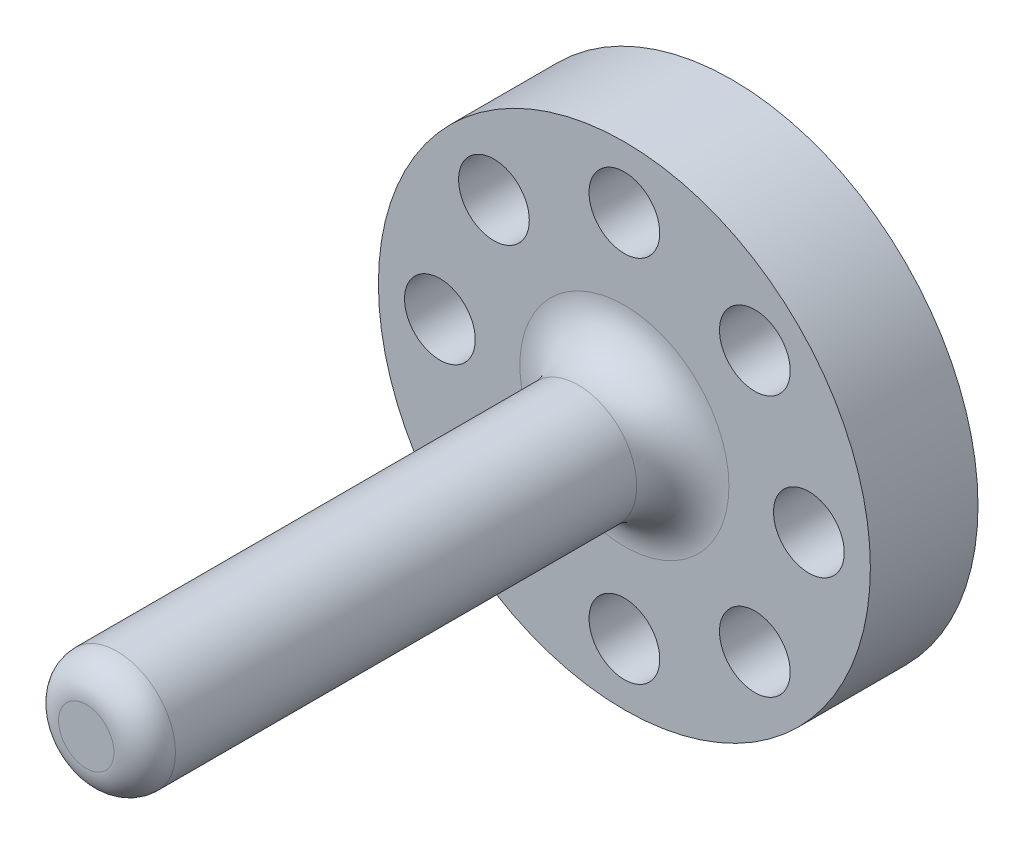
ISO-10303-21;
HEADER;
FILE_DESCRIPTION(('STEP AP214'),'2;1');
FILE_NAME('part.step','',(''),(''),'','','');
FILE_SCHEMA(('AUTOMOTIVE_DESIGN { 1 0 10303 214 1 1 1 1 }'));
ENDSEC;
DATA;
#1=APPLICATION_CONTEXT('core data for automotive mechanical design processes');
#2=APPLICATION_PROTOCOL_DEFINITION('international standard','automotive_design',2000,#1);
#3=PRODUCT_CONTEXT('',#1,'mechanical');
#4=PRODUCT('Part','Part','',(#3));
#5=PRODUCT_RELATED_PRODUCT_CATEGORY('part','',(#4));
#6=PRODUCT_DEFINITION_FORMATION('','',#4);
#7=PRODUCT_DEFINITION_CONTEXT('part definition',#1,'design');
#8=PRODUCT_DEFINITION('design','',#6,#7);
#9=PRODUCT_DEFINITION_SHAPE('','',#8);
#10=(LENGTH_UNIT() NAMED_UNIT(*) SI_UNIT(.MILLI.,.METRE.));
#11=(NAMED_UNIT(*) PLANE_ANGLE_UNIT() SI_UNIT($,.RADIAN.));
#12=(NAMED_UNIT(*) SI_UNIT($,.STERADIAN.) SOLID_ANGLE_UNIT());
#13=UNCERTAINTY_MEASURE_WITH_UNIT(LENGTH_MEASURE(1.E-05),#10,'distance_accuracy_value','');
#14=(GEOMETRIC_REPRESENTATION_CONTEXT(3) GLOBAL_UNCERTAINTY_ASSIGNED_CONTEXT((#13)) GLOBAL_UNIT_ASSIGNED_CONTEXT((#10,
#11,#12)) REPRESENTATION_CONTEXT('',''));
#15=CARTESIAN_POINT('',(0.,0.,0.));
#16=DIRECTION('',(0.,0.,1.));
#17=DIRECTION('',(1.,0.,0.));
#18=AXIS2_PLACEMENT_3D('',#15,#16,#17);
#19=CARTESIAN_POINT('',(0.,0.,0.));
#20=DIRECTION('',(0.,0.,1.));
#21=DIRECTION('',(1.,0.,0.));
#22=AXIS2_PLACEMENT_3D('',#19,#20,#21);
#23=PLANE('',#22);
#24=CARTESIAN_POINT('',(0.,0.,0.));
#25=DIRECTION('',(0.,0.,1.));
#26=DIRECTION('',(1.,0.,0.));
#27=AXIS2_PLACEMENT_3D('',#24,#25,#26);
#28=CIRCLE('',#27,8.);
#29=CARTESIAN_POINT('',(8.,0.,0.));
#30=VERTEX_POINT('',#29);
#31=EDGE_CURVE('E51',#30,#30,#28,.T.);
#32=ORIENTED_EDGE('',*,*,#31,.F.);
#33=EDGE_LOOP('',(#32));
#34=FACE_BOUND('',#33,.T.);
#35=CARTESIAN_POINT('',(0.,6.,0.));
#36=DIRECTION('',(0.,0.,1.));
#37=DIRECTION('',(1.,0.,0.));
#38=AXIS2_PLACEMENT_3D('',#35,#36,#37);
#39=CIRCLE('',#38,1.15);
#40=CARTESIAN_POINT('',(1.15,6.,0.));
#41=VERTEX_POINT('',#40);
#42=EDGE_CURVE('E54',#41,#41,#39,.T.);
#43=ORIENTED_EDGE('',*,*,#42,.T.);
#44=EDGE_LOOP('',(#43));
#45=FACE_BOUND('',#44,.T.);
#46=CARTESIAN_POINT('',(4.24264068711929,4.24264068711929,0.));
#47=DIRECTION('',(0.,0.,1.));
#48=DIRECTION('',(1.,0.,0.));
#49=AXIS2_PLACEMENT_3D('',#46,#47,#48);
#50=CIRCLE('',#49,1.15);
#51=CARTESIAN_POINT('',(5.39264068711929,4.24264068711929,0.));
#52=VERTEX_POINT('',#51);
#53=EDGE_CURVE('E57',#52,#52,#50,.T.);
#54=ORIENTED_EDGE('',*,*,#53,.T.);
#55=EDGE_LOOP('',(#54));
#56=FACE_BOUND('',#55,.T.);
#57=CARTESIAN_POINT('',(6.,0.,0.));
#58=DIRECTION('',(0.,0.,1.));
#59=DIRECTION('',(1.,0.,0.));
#60=AXIS2_PLACEMENT_3D('',#57,#58,#59);
#61=CIRCLE('',#60,1.15);
#62=CARTESIAN_POINT('',(7.15,0.,0.));
#63=VERTEX_POINT('',#62);
#64=EDGE_CURVE('E60',#63,#63,#61,.T.);
#65=ORIENTED_EDGE('',*,*,#64,.T.);
#66=EDGE_LOOP('',(#65));
#67=FACE_BOUND('',#66,.T.);
#68=CARTESIAN_POINT('',(4.24264068711929,-4.24264068711928,0.));
#69=DIRECTION('',(0.,0.,1.));
#70=DIRECTION('',(1.,0.,0.));
#71=AXIS2_PLACEMENT_3D('',#68,#69,#70);
#72=CIRCLE('',#71,1.15);
#73=CARTESIAN_POINT('',(5.39264068711929,-4.24264068711928,0.));
#74=VERTEX_POINT('',#73);
#75=EDGE_CURVE('E63',#74,#74,#72,.T.);
#76=ORIENTED_EDGE('',*,*,#75,.T.);
#77=EDGE_LOOP('',(#76));
#78=FACE_BOUND('',#77,.T.);
#79=CARTESIAN_POINT('',(0.,-6.,0.));
#80=DIRECTION('',(0.,0.,1.));
#81=DIRECTION('',(1.,0.,0.));
#82=AXIS2_PLACEMENT_3D('',#79,#80,#81);
#83=CIRCLE('',#82,1.15);
#84=CARTESIAN_POINT('',(1.15,-6.,0.));
#85=VERTEX_POINT('',#84);
#86=EDGE_CURVE('E66',#85,#85,#83,.T.);
#87=ORIENTED_EDGE('',*,*,#86,.T.);
#88=EDGE_LOOP('',(#87));
#89=FACE_BOUND('',#88,.T.);
#90=CARTESIAN_POINT('',(-4.24264068711928,-4.24264068711929,0.));
#91=DIRECTION('',(0.,0.,1.));
#92=DIRECTION('',(1.,0.,0.));
#93=AXIS2_PLACEMENT_3D('',#90,#91,#92);
#94=CIRCLE('',#93,1.15);
#95=CARTESIAN_POINT('',(-3.09264068711928,-4.24264068711929,0.));
#96=VERTEX_POINT('',#95);
#97=EDGE_CURVE('E69',#96,#96,#94,.T.);
#98=ORIENTED_EDGE('',*,*,#97,.T.);
#99=EDGE_LOOP('',(#98));
#100=FACE_BOUND('',#99,.T.);
#101=CARTESIAN_POINT('',(-6.,0.,0.));
#102=DIRECTION('',(0.,0.,1.));
#103=DIRECTION('',(1.,0.,0.));
#104=AXIS2_PLACEMENT_3D('',#101,#102,#103);
#105=CIRCLE('',#104,1.15);
#106=CARTESIAN_POINT('',(-4.85,0.,0.));
#107=VERTEX_POINT('',#106);
#108=EDGE_CURVE('E72',#107,#107,#105,.T.);
#109=ORIENTED_EDGE('',*,*,#108,.T.);
#110=EDGE_LOOP('',(#109));
#111=FACE_BOUND('',#110,.T.);
#112=CARTESIAN_POINT('',(-4.24264068711929,4.24264068711928,0.));
#113=DIRECTION('',(0.,0.,1.));
#114=DIRECTION('',(1.,0.,0.));
#115=AXIS2_PLACEMENT_3D('',#112,#113,#114);
#116=CIRCLE('',#115,1.15);
#117=CARTESIAN_POINT('',(-3.09264068711929,4.24264068711928,0.));
#118=VERTEX_POINT('',#117);
#119=EDGE_CURVE('E75',#118,#118,#116,.T.);
#120=ORIENTED_EDGE('',*,*,#119,.T.);
#121=EDGE_LOOP('',(#120));
#122=FACE_BOUND('',#121,.T.);
#123=CARTESIAN_POINT('',(0.,0.,0.));
#124=DIRECTION('',(0.,0.,1.));
#125=DIRECTION('',(1.,0.,0.));
#126=AXIS2_PLACEMENT_3D('',#123,#124,#125);
#127=CIRCLE('',#126,4.);
#128=CARTESIAN_POINT('',(4.,0.,0.));
#129=VERTEX_POINT('',#128);
#130=EDGE_CURVE('E78',#129,#129,#127,.T.);
#131=ORIENTED_EDGE('',*,*,#130,.T.);
#132=EDGE_LOOP('',(#131));
#133=FACE_BOUND('',#132,.T.);
#134=ADVANCED_FACE('F31',(#34,#45,#56,#67,#78,#89,#100,#111,#122,#133),#23,.F.);
#135=CARTESIAN_POINT('',(0.,0.,2.));
#136=DIRECTION('',(0.,0.,-1.));
#137=DIRECTION('',(-1.,0.,0.));
#138=AXIS2_PLACEMENT_3D('',#135,#136,#137);
#139=CYLINDRICAL_SURFACE('',#138,8.);
#140=ORIENTED_EDGE('',*,*,#31,.T.);
#141=EDGE_LOOP('',(#140));
#142=FACE_BOUND('',#141,.T.);
#143=CARTESIAN_POINT('',(0.,0.,3.5));
#144=DIRECTION('',(0.,0.,1.));
#145=DIRECTION('',(1.,0.,0.));
#146=AXIS2_PLACEMENT_3D('',#143,#144,#145);
#147=CIRCLE('',#146,8.);
#148=CARTESIAN_POINT('',(8.,0.,3.5));
#149=VERTEX_POINT('',#148);
#150=EDGE_CURVE('E84',#149,#149,#147,.T.);
#151=ORIENTED_EDGE('',*,*,#150,.F.);
#152=EDGE_LOOP('',(#151));
#153=FACE_BOUND('',#152,.T.);
#154=ADVANCED_FACE('F130',(#142,#153),#139,.T.);
#155=CARTESIAN_POINT('',(0.,6.,2.));
#156=DIRECTION('',(0.,0.,-1.));
#157=DIRECTION('',(-1.,0.,0.));
#158=AXIS2_PLACEMENT_3D('',#155,#156,#157);
#159=CYLINDRICAL_SURFACE('',#158,1.15);
#160=ORIENTED_EDGE('',*,*,#42,.F.);
#161=EDGE_LOOP('',(#160));
#162=FACE_BOUND('',#161,.T.);
#163=CARTESIAN_POINT('',(0.,6.,3.5));
#164=DIRECTION('',(0.,0.,1.));
#165=DIRECTION('',(1.,0.,0.));
#166=AXIS2_PLACEMENT_3D('',#163,#164,#165);
#167=CIRCLE('',#166,1.15);
#168=CARTESIAN_POINT('',(1.15,6.,3.5));
#169=VERTEX_POINT('',#168);
#170=EDGE_CURVE('E87',#169,#169,#167,.T.);
#171=ORIENTED_EDGE('',*,*,#170,.T.);
#172=EDGE_LOOP('',(#171));
#173=FACE_BOUND('',#172,.T.);
#174=ADVANCED_FACE('F136',(#162,#173),#159,.F.);
#175=CARTESIAN_POINT('',(4.24264068711929,4.24264068711929,2.));
#176=DIRECTION('',(0.,0.,-1.));
#177=DIRECTION('',(-1.,0.,0.));
#178=AXIS2_PLACEMENT_3D('',#175,#176,#177);
#179=CYLINDRICAL_SURFACE('',#178,1.15);
#180=ORIENTED_EDGE('',*,*,#53,.F.);
#181=EDGE_LOOP('',(#180));
#182=FACE_BOUND('',#181,.T.);
#183=CARTESIAN_POINT('',(4.24264068711929,4.24264068711929,3.5));
#184=DIRECTION('',(0.,0.,1.));
#185=DIRECTION('',(1.,0.,0.));
#186=AXIS2_PLACEMENT_3D('',#183,#184,#185);
#187=CIRCLE('',#186,1.15);
#188=CARTESIAN_POINT('',(5.39264068711929,4.24264068711929,3.5));
#189=VERTEX_POINT('',#188);
#190=EDGE_CURVE('E90',#189,#189,#187,.T.);
#191=ORIENTED_EDGE('',*,*,#190,.T.);
#192=EDGE_LOOP('',(#191));
#193=FACE_BOUND('',#192,.T.);
#194=ADVANCED_FACE('F256',(#182,#193),#179,.F.);
#195=CARTESIAN_POINT('',(6.,0.,2.));
#196=DIRECTION('',(0.,0.,-1.));
#197=DIRECTION('',(-1.,0.,0.));
#198=AXIS2_PLACEMENT_3D('',#195,#196,#197);
#199=CYLINDRICAL_SURFACE('',#198,1.15);
#200=ORIENTED_EDGE('',*,*,#64,.F.);
#201=EDGE_LOOP('',(#200));
#202=FACE_BOUND('',#201,.T.);
#203=CARTESIAN_POINT('',(6.,0.,3.5));
#204=DIRECTION('',(0.,0.,1.));
#205=DIRECTION('',(1.,0.,0.));
#206=AXIS2_PLACEMENT_3D('',#203,#204,#205);
#207=CIRCLE('',#206,1.15);
#208=CARTESIAN_POINT('',(7.15,0.,3.5));
#209=VERTEX_POINT('',#208);
#210=EDGE_CURVE('E93',#209,#209,#207,.T.);
#211=ORIENTED_EDGE('',*,*,#210,.T.);
#212=EDGE_LOOP('',(#211));
#213=FACE_BOUND('',#212,.T.);
#214=ADVANCED_FACE('F244',(#202,#213),#199,.F.);
#215=CARTESIAN_POINT('',(4.24264068711929,-4.24264068711928,2.));
#216=DIRECTION('',(0.,0.,-1.));
#217=DIRECTION('',(-1.,0.,0.));
#218=AXIS2_PLACEMENT_3D('',#215,#216,#217);
#219=CYLINDRICAL_SURFACE('',#218,1.15);
#220=ORIENTED_EDGE('',*,*,#75,.F.);
#221=EDGE_LOOP('',(#220));
#222=FACE_BOUND('',#221,.T.);
#223=CARTESIAN_POINT('',(4.24264068711929,-4.24264068711928,3.5));
#224=DIRECTION('',(0.,0.,1.));
#225=DIRECTION('',(1.,0.,0.));
#226=AXIS2_PLACEMENT_3D('',#223,#224,#225);
#227=CIRCLE('',#226,1.15);
#228=CARTESIAN_POINT('',(5.39264068711929,-4.24264068711928,3.5));
#229=VERTEX_POINT('',#228);
#230=EDGE_CURVE('E96',#229,#229,#227,.T.);
#231=ORIENTED_EDGE('',*,*,#230,.T.);
#232=EDGE_LOOP('',(#231));
#233=FACE_BOUND('',#232,.T.);
#234=ADVANCED_FACE('F232',(#222,#233),#219,.F.);
#235=CARTESIAN_POINT('',(0.,-6.,2.));
#236=DIRECTION('',(0.,0.,-1.));
#237=DIRECTION('',(-1.,0.,0.));
#238=AXIS2_PLACEMENT_3D('',#235,#236,#237);
#239=CYLINDRICAL_SURFACE('',#238,1.15);
#240=ORIENTED_EDGE('',*,*,#86,.F.);
#241=EDGE_LOOP('',(#240));
#242=FACE_BOUND('',#241,.T.);
#243=CARTESIAN_POINT('',(0.,-6.,3.5));
#244=DIRECTION('',(0.,0.,1.));
#245=DIRECTION('',(1.,0.,0.));
#246=AXIS2_PLACEMENT_3D('',#243,#244,#245);
#247=CIRCLE('',#246,1.15);
#248=CARTESIAN_POINT('',(1.15,-6.,3.5));
#249=VERTEX_POINT('',#248);
#250=EDGE_CURVE('E99',#249,#249,#247,.T.);
#251=ORIENTED_EDGE('',*,*,#250,.T.);
#252=EDGE_LOOP('',(#251));
#253=FACE_BOUND('',#252,.T.);
#254=ADVANCED_FACE('F220',(#242,#253),#239,.F.);
#255=CARTESIAN_POINT('',(-4.24264068711928,-4.24264068711929,2.));
#256=DIRECTION('',(0.,0.,-1.));
#257=DIRECTION('',(-1.,0.,0.));
#258=AXIS2_PLACEMENT_3D('',#255,#256,#257);
#259=CYLINDRICAL_SURFACE('',#258,1.15);
#260=ORIENTED_EDGE('',*,*,#97,.F.);
#261=EDGE_LOOP('',(#260));
#262=FACE_BOUND('',#261,.T.);
#263=CARTESIAN_POINT('',(-4.24264068711928,-4.24264068711929,3.5));
#264=DIRECTION('',(0.,0.,1.));
#265=DIRECTION('',(1.,0.,0.));
#266=AXIS2_PLACEMENT_3D('',#263,#264,#265);
#267=CIRCLE('',#266,1.15);
#268=CARTESIAN_POINT('',(-3.09264068711928,-4.24264068711929,3.5));
#269=VERTEX_POINT('',#268);
#270=EDGE_CURVE('E102',#269,#269,#267,.T.);
#271=ORIENTED_EDGE('',*,*,#270,.T.);
#272=EDGE_LOOP('',(#271));
#273=FACE_BOUND('',#272,.T.);
#274=ADVANCED_FACE('F208',(#262,#273),#259,.F.);
#275=CARTESIAN_POINT('',(-6.,0.,2.));
#276=DIRECTION('',(0.,0.,-1.));
#277=DIRECTION('',(-1.,0.,0.));
#278=AXIS2_PLACEMENT_3D('',#275,#276,#277);
#279=CYLINDRICAL_SURFACE('',#278,1.15);
#280=ORIENTED_EDGE('',*,*,#108,.F.);
#281=EDGE_LOOP('',(#280));
#282=FACE_BOUND('',#281,.T.);
#283=CARTESIAN_POINT('',(-6.,0.,3.5));
#284=DIRECTION('',(0.,0.,1.));
#285=DIRECTION('',(1.,0.,0.));
#286=AXIS2_PLACEMENT_3D('',#283,#284,#285);
#287=CIRCLE('',#286,1.15);
#288=CARTESIAN_POINT('',(-4.85,0.,3.5));
#289=VERTEX_POINT('',#288);
#290=EDGE_CURVE('E105',#289,#289,#287,.T.);
#291=ORIENTED_EDGE('',*,*,#290,.T.);
#292=EDGE_LOOP('',(#291));
#293=FACE_BOUND('',#292,.T.);
#294=ADVANCED_FACE('F195',(#282,#293),#279,.F.);
#295=CARTESIAN_POINT('',(-4.24264068711929,4.24264068711928,2.));
#296=DIRECTION('',(0.,0.,-1.));
#297=DIRECTION('',(-1.,0.,0.));
#298=AXIS2_PLACEMENT_3D('',#295,#296,#297);
#299=CYLINDRICAL_SURFACE('',#298,1.15);
#300=ORIENTED_EDGE('',*,*,#119,.F.);
#301=EDGE_LOOP('',(#300));
#302=FACE_BOUND('',#301,.T.);
#303=CARTESIAN_POINT('',(-4.24264068711929,4.24264068711928,3.5));
#304=DIRECTION('',(0.,0.,1.));
#305=DIRECTION('',(1.,0.,0.));
#306=AXIS2_PLACEMENT_3D('',#303,#304,#305);
#307=CIRCLE('',#306,1.15);
#308=CARTESIAN_POINT('',(-3.09264068711929,4.24264068711928,3.5));
#309=VERTEX_POINT('',#308);
#310=EDGE_CURVE('E108',#309,#309,#307,.T.);
#311=ORIENTED_EDGE('',*,*,#310,.T.);
#312=EDGE_LOOP('',(#311));
#313=FACE_BOUND('',#312,.T.);
#314=ADVANCED_FACE('F112',(#302,#313),#299,.F.);
#315=CARTESIAN_POINT('',(0.,0.,2.));
#316=DIRECTION('',(0.,0.,-1.));
#317=DIRECTION('',(-1.,0.,0.));
#318=AXIS2_PLACEMENT_3D('',#315,#316,#317);
#319=CYLINDRICAL_SURFACE('',#318,4.);
#320=CARTESIAN_POINT('',(0.,0.,2.));
#321=DIRECTION('',(0.,0.,1.));
#322=DIRECTION('',(1.,0.,0.));
#323=AXIS2_PLACEMENT_3D('',#320,#321,#322);
#324=CIRCLE('',#323,4.);
#325=CARTESIAN_POINT('',(4.,0.,2.));
#326=VERTEX_POINT('',#325);
#327=EDGE_CURVE('E81',#326,#326,#324,.T.);
#328=ORIENTED_EDGE('',*,*,#327,.T.);
#329=EDGE_LOOP('',(#328));
#330=FACE_BOUND('',#329,.T.);
#331=ORIENTED_EDGE('',*,*,#130,.F.);
#332=EDGE_LOOP('',(#331));
#333=FACE_BOUND('',#332,.T.);
#334=ADVANCED_FACE('F125',(#330,#333),#319,.F.);
#335=CARTESIAN_POINT('',(0.,0.,2.));
#336=DIRECTION('',(0.,0.,1.));
#337=DIRECTION('',(1.,0.,0.));
#338=AXIS2_PLACEMENT_3D('',#335,#336,#337);
#339=PLANE('',#338);
#340=ORIENTED_EDGE('',*,*,#327,.F.);
#341=EDGE_LOOP('',(#340));
#342=FACE_BOUND('',#341,.T.);
#343=ADVANCED_FACE('F117',(#342),#339,.F.);
#344=CARTESIAN_POINT('',(0.,0.,3.5));
#345=DIRECTION('',(0.,0.,1.));
#346=DIRECTION('',(1.,0.,0.));
#347=AXIS2_PLACEMENT_3D('',#344,#345,#346);
#348=PLANE('',#347);
#349=CARTESIAN_POINT('',(0.,0.,3.5));
#350=DIRECTION('',(0.,0.,1.));
#351=DIRECTION('',(1.,0.,0.));
#352=AXIS2_PLACEMENT_3D('',#349,#350,#351);
#353=CIRCLE('',#352,3.4);
#354=CARTESIAN_POINT('',(3.4,0.,3.5));
#355=VERTEX_POINT('',#354);
#356=EDGE_CURVE('E10',#355,#355,#353,.F.);
#357=ORIENTED_EDGE('',*,*,#356,.T.);
#358=EDGE_LOOP('',(#357));
#359=FACE_BOUND('',#358,.T.);
#360=ORIENTED_EDGE('',*,*,#290,.F.);
#361=EDGE_LOOP('',(#360));
#362=FACE_BOUND('',#361,.T.);
#363=ORIENTED_EDGE('',*,*,#250,.F.);
#364=EDGE_LOOP('',(#363));
#365=FACE_BOUND('',#364,.T.);
#366=ORIENTED_EDGE('',*,*,#210,.F.);
#367=EDGE_LOOP('',(#366));
#368=FACE_BOUND('',#367,.T.);
#369=ORIENTED_EDGE('',*,*,#170,.F.);
#370=EDGE_LOOP('',(#369));
#371=FACE_BOUND('',#370,.T.);
#372=ORIENTED_EDGE('',*,*,#150,.T.);
#373=EDGE_LOOP('',(#372));
#374=FACE_BOUND('',#373,.T.);
#375=ORIENTED_EDGE('',*,*,#190,.F.);
#376=EDGE_LOOP('',(#375));
#377=FACE_BOUND('',#376,.T.);
#378=ORIENTED_EDGE('',*,*,#230,.F.);
#379=EDGE_LOOP('',(#378));
#380=FACE_BOUND('',#379,.T.);
#381=ORIENTED_EDGE('',*,*,#270,.F.);
#382=EDGE_LOOP('',(#381));
#383=FACE_BOUND('',#382,.T.);
#384=ORIENTED_EDGE('',*,*,#310,.F.);
#385=EDGE_LOOP('',(#384));
#386=FACE_BOUND('',#385,.T.);
#387=ADVANCED_FACE('F114',(#359,#362,#365,#368,#371,#374,#377,#380,#383,#386),#348,.T.);
#388=CARTESIAN_POINT('',(0.,0.,21.));
#389=DIRECTION('',(0.,0.,-1.));
#390=DIRECTION('',(-1.,0.,0.));
#391=AXIS2_PLACEMENT_3D('',#388,#389,#390);
#392=CYLINDRICAL_SURFACE('',#391,1.9);
#393=CARTESIAN_POINT('',(0.,0.,5.));
#394=DIRECTION('',(0.,0.,1.));
#395=DIRECTION('',(1.,0.,0.));
#396=AXIS2_PLACEMENT_3D('',#393,#394,#395);
#397=CIRCLE('',#396,1.9);
#398=CARTESIAN_POINT('',(1.9,0.,5.));
#399=VERTEX_POINT('',#398);
#400=EDGE_CURVE('E38',#399,#399,#397,.T.);
#401=ORIENTED_EDGE('',*,*,#400,.T.);
#402=EDGE_LOOP('',(#401));
#403=FACE_BOUND('',#402,.T.);
#404=CARTESIAN_POINT('',(0.,0.,20.));
#405=DIRECTION('',(0.,0.,1.));
#406=DIRECTION('',(1.,0.,0.));
#407=AXIS2_PLACEMENT_3D('',#404,#405,#406);
#408=CIRCLE('',#407,1.9);
#409=CARTESIAN_POINT('',(1.9,0.,20.));
#410=VERTEX_POINT('',#409);
#411=EDGE_CURVE('E42',#410,#410,#408,.F.);
#412=ORIENTED_EDGE('',*,*,#411,.T.);
#413=EDGE_LOOP('',(#412));
#414=FACE_BOUND('',#413,.T.);
#415=ADVANCED_FACE('F116',(#403,#414),#392,.T.);
#416=CARTESIAN_POINT('',(0.,0.,21.));
#417=DIRECTION('',(0.,0.,1.));
#418=DIRECTION('',(1.,0.,0.));
#419=AXIS2_PLACEMENT_3D('',#416,#417,#418);
#420=PLANE('',#419);
#421=CARTESIAN_POINT('',(0.,0.,21.));
#422=DIRECTION('',(0.,0.,1.));
#423=DIRECTION('',(1.,0.,0.));
#424=AXIS2_PLACEMENT_3D('',#421,#422,#423);
#425=CIRCLE('',#424,0.9);
#426=CARTESIAN_POINT('',(0.9,0.,21.));
#427=VERTEX_POINT('',#426);
#428=EDGE_CURVE('E46',#427,#427,#425,.T.);
#429=ORIENTED_EDGE('',*,*,#428,.T.);
#430=EDGE_LOOP('',(#429));
#431=FACE_BOUND('',#430,.T.);
#432=ADVANCED_FACE('F123',(#431),#420,.T.);
#433=CARTESIAN_POINT('',(0.,0.,20.));
#434=DIRECTION('',(0.,0.,1.));
#435=DIRECTION('',(1.,0.,0.));
#436=AXIS2_PLACEMENT_3D('',#433,#434,#435);
#437=DEGENERATE_TOROIDAL_SURFACE('',#436,0.9,1.,.T.);
#438=ORIENTED_EDGE('',*,*,#411,.F.);
#439=EDGE_LOOP('',(#438));
#440=FACE_BOUND('',#439,.T.);
#441=ORIENTED_EDGE('',*,*,#428,.F.);
#442=EDGE_LOOP('',(#441));
#443=FACE_BOUND('',#442,.T.);
#444=ADVANCED_FACE('F143',(#440,#443),#437,.T.);
#445=CARTESIAN_POINT('',(0.,0.,5.));
#446=DIRECTION('',(0.,0.,1.));
#447=DIRECTION('',(1.,0.,0.));
#448=AXIS2_PLACEMENT_3D('',#445,#446,#447);
#449=TOROIDAL_SURFACE('',#448,3.4,1.5);
#450=ORIENTED_EDGE('',*,*,#356,.F.);
#451=EDGE_LOOP('',(#450));
#452=FACE_BOUND('',#451,.T.);
#453=ORIENTED_EDGE('',*,*,#400,.F.);
#454=EDGE_LOOP('',(#453));
#455=FACE_BOUND('',#454,.T.);
#456=ADVANCED_FACE('F33',(#452,#455),#449,.F.);
#457=CLOSED_SHELL('',(#134,#154,#174,#194,#214,#234,#254,#274,#294,#314,#334,#343,#387,#415,
#432,#444,#456));
#458=MANIFOLD_SOLID_BREP('B2',#457);
#459=ADVANCED_BREP_SHAPE_REPRESENTATION('',(#18,#458),#14);
#460=SHAPE_DEFINITION_REPRESENTATION(#9,#459);
ENDSEC;
END-ISO-10303-21;
